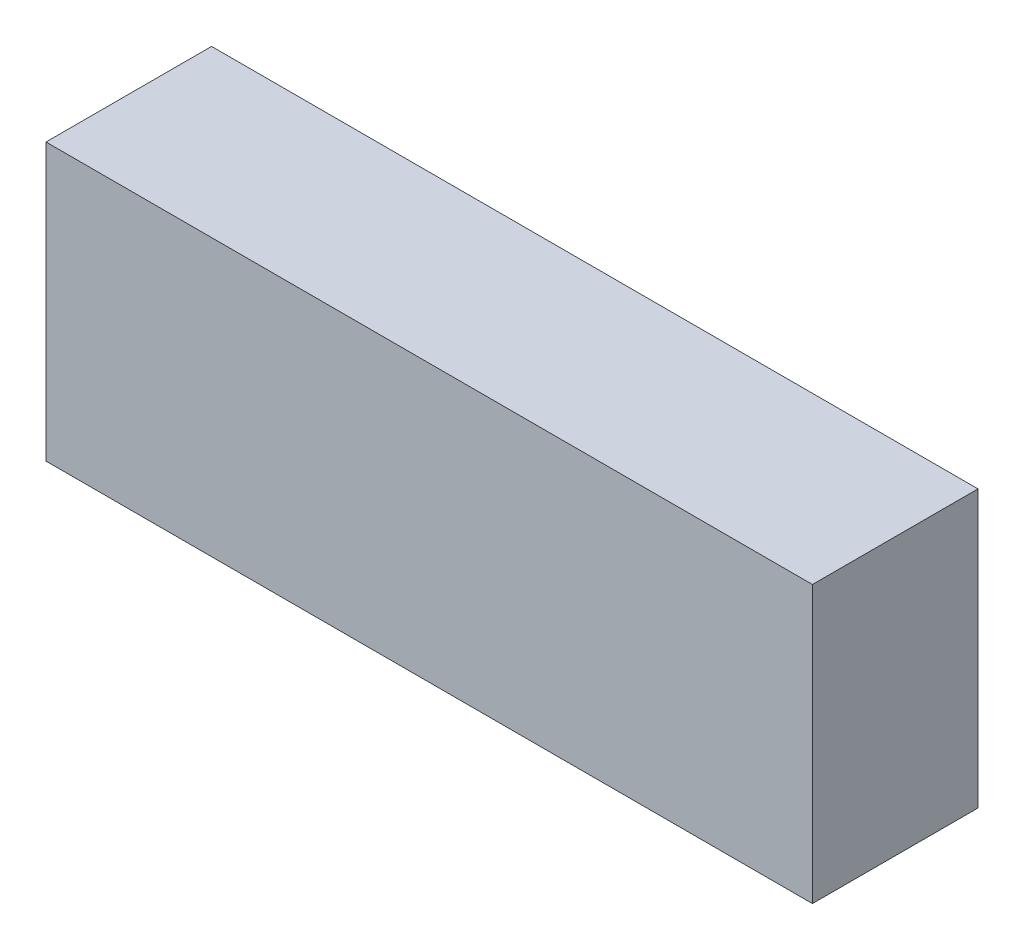
ISO-10303-21;
HEADER;
FILE_DESCRIPTION(('STEP AP214'),'2;1');
FILE_NAME('part.step','',(''),(''),'','','');
FILE_SCHEMA(('AUTOMOTIVE_DESIGN { 1 0 10303 214 1 1 1 1 }'));
ENDSEC;
DATA;
#1=APPLICATION_CONTEXT('core data for automotive mechanical design processes');
#2=APPLICATION_PROTOCOL_DEFINITION('international standard','automotive_design',2000,#1);
#3=PRODUCT_CONTEXT('',#1,'mechanical');
#4=PRODUCT('Part','Part','',(#3));
#5=PRODUCT_RELATED_PRODUCT_CATEGORY('part','',(#4));
#6=PRODUCT_DEFINITION_FORMATION('','',#4);
#7=PRODUCT_DEFINITION_CONTEXT('part definition',#1,'design');
#8=PRODUCT_DEFINITION('design','',#6,#7);
#9=PRODUCT_DEFINITION_SHAPE('','',#8);
#10=(LENGTH_UNIT() NAMED_UNIT(*) SI_UNIT(.MILLI.,.METRE.));
#11=(NAMED_UNIT(*) PLANE_ANGLE_UNIT() SI_UNIT($,.RADIAN.));
#12=(NAMED_UNIT(*) SI_UNIT($,.STERADIAN.) SOLID_ANGLE_UNIT());
#13=UNCERTAINTY_MEASURE_WITH_UNIT(LENGTH_MEASURE(1.E-05),#10,'distance_accuracy_value','');
#14=(GEOMETRIC_REPRESENTATION_CONTEXT(3) GLOBAL_UNCERTAINTY_ASSIGNED_CONTEXT((#13)) GLOBAL_UNIT_ASSIGNED_CONTEXT((#10,
#11,#12)) REPRESENTATION_CONTEXT('',''));
#15=CARTESIAN_POINT('',(0.,0.,0.));
#16=DIRECTION('',(0.,0.,1.));
#17=DIRECTION('',(1.,0.,0.));
#18=AXIS2_PLACEMENT_3D('',#15,#16,#17);
#19=CARTESIAN_POINT('',(-4.45549999999999,77.5714301256037,7.25));
#20=DIRECTION('',(1.,0.,0.));
#21=DIRECTION('',(0.,1.,0.));
#22=AXIS2_PLACEMENT_3D('',#19,#20,#21);
#23=PLANE('',#22);
#24=DIRECTION('',(0.,-1.,0.));
#25=VECTOR('',#24,1.);
#26=CARTESIAN_POINT('',(-4.45549999999999,77.5714301256037,0.));
#27=LINE('',#26,#25);
#28=CARTESIAN_POINT('',(-4.45549999999999,77.5714301256037,0.));
#29=VERTEX_POINT('',#28);
#30=CARTESIAN_POINT('',(-4.45549999999999,65.47,0.));
#31=VERTEX_POINT('',#30);
#32=EDGE_CURVE('E149',#29,#31,#27,.T.);
#33=ORIENTED_EDGE('',*,*,#32,.T.);
#34=DIRECTION('',(0.,0.,-1.));
#35=VECTOR('',#34,1.);
#36=CARTESIAN_POINT('',(-4.45549999999999,65.47,7.25));
#37=LINE('',#36,#35);
#38=CARTESIAN_POINT('',(-4.45549999999999,65.47,7.25));
#39=VERTEX_POINT('',#38);
#40=EDGE_CURVE('E11',#39,#31,#37,.T.);
#41=ORIENTED_EDGE('',*,*,#40,.F.);
#42=DIRECTION('',(0.,-1.,0.));
#43=VECTOR('',#42,1.);
#44=CARTESIAN_POINT('',(-4.45549999999999,77.5714301256037,7.25));
#45=LINE('',#44,#43);
#46=CARTESIAN_POINT('',(-4.45549999999999,77.5714301256037,7.25));
#47=VERTEX_POINT('',#46);
#48=EDGE_CURVE('E140',#47,#39,#45,.T.);
#49=ORIENTED_EDGE('',*,*,#48,.F.);
#50=DIRECTION('',(0.,0.,-1.));
#51=VECTOR('',#50,1.);
#52=CARTESIAN_POINT('',(-4.45549999999999,77.5714301256037,7.25));
#53=LINE('',#52,#51);
#54=EDGE_CURVE('E55',#47,#29,#53,.T.);
#55=ORIENTED_EDGE('',*,*,#54,.T.);
#56=EDGE_LOOP('',(#33,#41,#49,#55));
#57=FACE_BOUND('',#56,.T.);
#58=ADVANCED_FACE('F32',(#57),#23,.F.);
#59=CARTESIAN_POINT('',(-4.45549999999999,65.47,7.25));
#60=DIRECTION('',(0.,1.,0.));
#61=DIRECTION('',(0.,0.,1.));
#62=AXIS2_PLACEMENT_3D('',#59,#60,#61);
#63=PLANE('',#62);
#64=DIRECTION('',(1.,0.,0.));
#65=VECTOR('',#64,1.);
#66=CARTESIAN_POINT('',(-4.45549999999999,65.47,0.));
#67=LINE('',#66,#65);
#68=CARTESIAN_POINT('',(29.1045,65.47,0.));
#69=VERTEX_POINT('',#68);
#70=EDGE_CURVE('E151',#31,#69,#67,.T.);
#71=ORIENTED_EDGE('',*,*,#70,.T.);
#72=DIRECTION('',(0.,0.,-1.));
#73=VECTOR('',#72,1.);
#74=CARTESIAN_POINT('',(29.1045,65.47,7.25));
#75=LINE('',#74,#73);
#76=CARTESIAN_POINT('',(29.1045,65.47,7.25));
#77=VERTEX_POINT('',#76);
#78=EDGE_CURVE('E39',#77,#69,#75,.T.);
#79=ORIENTED_EDGE('',*,*,#78,.F.);
#80=DIRECTION('',(1.,0.,0.));
#81=VECTOR('',#80,1.);
#82=CARTESIAN_POINT('',(-4.45549999999999,65.47,7.25));
#83=LINE('',#82,#81);
#84=EDGE_CURVE('E81',#39,#77,#83,.T.);
#85=ORIENTED_EDGE('',*,*,#84,.F.);
#86=ORIENTED_EDGE('',*,*,#40,.T.);
#87=EDGE_LOOP('',(#71,#79,#85,#86));
#88=FACE_BOUND('',#87,.T.);
#89=ADVANCED_FACE('F166',(#88),#63,.F.);
#90=CARTESIAN_POINT('',(29.1045,77.5714301256037,7.25));
#91=DIRECTION('',(1.,0.,0.));
#92=DIRECTION('',(0.,0.,-1.));
#93=AXIS2_PLACEMENT_3D('',#90,#91,#92);
#94=PLANE('',#93);
#95=DIRECTION('',(0.,-1.,0.));
#96=VECTOR('',#95,1.);
#97=CARTESIAN_POINT('',(29.1045,77.5714301256037,0.));
#98=LINE('',#97,#96);
#99=CARTESIAN_POINT('',(29.1045,77.5714301256037,0.));
#100=VERTEX_POINT('',#99);
#101=EDGE_CURVE('E155',#100,#69,#98,.T.);
#102=ORIENTED_EDGE('',*,*,#101,.F.);
#103=DIRECTION('',(0.,0.,-1.));
#104=VECTOR('',#103,1.);
#105=CARTESIAN_POINT('',(29.1045,77.5714301256037,7.25));
#106=LINE('',#105,#104);
#107=CARTESIAN_POINT('',(29.1045,77.5714301256037,7.25));
#108=VERTEX_POINT('',#107);
#109=EDGE_CURVE('E161',#108,#100,#106,.T.);
#110=ORIENTED_EDGE('',*,*,#109,.F.);
#111=DIRECTION('',(0.,-1.,0.));
#112=VECTOR('',#111,1.);
#113=CARTESIAN_POINT('',(29.1045,77.5714301256037,7.25));
#114=LINE('',#113,#112);
#115=EDGE_CURVE('E144',#108,#77,#114,.T.);
#116=ORIENTED_EDGE('',*,*,#115,.T.);
#117=ORIENTED_EDGE('',*,*,#78,.T.);
#118=EDGE_LOOP('',(#102,#110,#116,#117));
#119=FACE_BOUND('',#118,.T.);
#120=ADVANCED_FACE('F164',(#119),#94,.T.);
#121=CARTESIAN_POINT('',(-4.45549999999999,77.5714301256037,7.25));
#122=DIRECTION('',(0.,1.,0.));
#123=DIRECTION('',(0.,0.,1.));
#124=AXIS2_PLACEMENT_3D('',#121,#122,#123);
#125=PLANE('',#124);
#126=DIRECTION('',(1.,0.,0.));
#127=VECTOR('',#126,1.);
#128=CARTESIAN_POINT('',(-4.45549999999999,77.5714301256037,0.));
#129=LINE('',#128,#127);
#130=EDGE_CURVE('E142',#29,#100,#129,.T.);
#131=ORIENTED_EDGE('',*,*,#130,.F.);
#132=ORIENTED_EDGE('',*,*,#54,.F.);
#133=DIRECTION('',(1.,0.,0.));
#134=VECTOR('',#133,1.);
#135=CARTESIAN_POINT('',(-4.45549999999999,77.5714301256037,7.25));
#136=LINE('',#135,#134);
#137=EDGE_CURVE('E147',#47,#108,#136,.T.);
#138=ORIENTED_EDGE('',*,*,#137,.T.);
#139=ORIENTED_EDGE('',*,*,#109,.T.);
#140=EDGE_LOOP('',(#131,#132,#138,#139));
#141=FACE_BOUND('',#140,.T.);
#142=ADVANCED_FACE('F170',(#141),#125,.T.);
#143=CARTESIAN_POINT('',(0.,0.,7.25));
#144=DIRECTION('',(0.,0.,1.));
#145=DIRECTION('',(1.,0.,0.));
#146=AXIS2_PLACEMENT_3D('',#143,#144,#145);
#147=PLANE('',#146);
#148=ORIENTED_EDGE('',*,*,#48,.T.);
#149=ORIENTED_EDGE('',*,*,#84,.T.);
#150=ORIENTED_EDGE('',*,*,#115,.F.);
#151=ORIENTED_EDGE('',*,*,#137,.F.);
#152=EDGE_LOOP('',(#148,#149,#150,#151));
#153=FACE_BOUND('',#152,.T.);
#154=ADVANCED_FACE('F173',(#153),#147,.T.);
#155=CARTESIAN_POINT('',(0.,0.,0.));
#156=DIRECTION('',(0.,0.,1.));
#157=DIRECTION('',(1.,0.,0.));
#158=AXIS2_PLACEMENT_3D('',#155,#156,#157);
#159=PLANE('',#158);
#160=DIRECTION('',(1.,0.,0.));
#161=VECTOR('',#160,1.);
#162=CARTESIAN_POINT('',(-4.45549999999999,77.0714301256037,0.));
#163=LINE('',#162,#161);
#164=CARTESIAN_POINT('',(-3.95549999999999,77.0714301256037,0.));
#165=VERTEX_POINT('',#164);
#166=CARTESIAN_POINT('',(28.6045,77.0714301256037,0.));
#167=VERTEX_POINT('',#166);
#168=EDGE_CURVE('E125',#165,#167,#163,.T.);
#169=ORIENTED_EDGE('',*,*,#168,.F.);
#170=DIRECTION('',(0.,-1.,0.));
#171=VECTOR('',#170,1.);
#172=CARTESIAN_POINT('',(-3.95549999999999,77.5714301256037,0.));
#173=LINE('',#172,#171);
#174=CARTESIAN_POINT('',(-3.95549999999999,65.97,0.));
#175=VERTEX_POINT('',#174);
#176=EDGE_CURVE('E112',#165,#175,#173,.T.);
#177=ORIENTED_EDGE('',*,*,#176,.T.);
#178=DIRECTION('',(1.,0.,0.));
#179=VECTOR('',#178,1.);
#180=CARTESIAN_POINT('',(-4.45549999999999,65.97,0.));
#181=LINE('',#180,#179);
#182=CARTESIAN_POINT('',(28.6045,65.97,0.));
#183=VERTEX_POINT('',#182);
#184=EDGE_CURVE('E135',#175,#183,#181,.T.);
#185=ORIENTED_EDGE('',*,*,#184,.T.);
#186=DIRECTION('',(0.,-1.,0.));
#187=VECTOR('',#186,1.);
#188=CARTESIAN_POINT('',(28.6045,77.5714301256037,0.));
#189=LINE('',#188,#187);
#190=EDGE_CURVE('E46',#167,#183,#189,.T.);
#191=ORIENTED_EDGE('',*,*,#190,.F.);
#192=EDGE_LOOP('',(#169,#177,#185,#191));
#193=FACE_BOUND('',#192,.T.);
#194=ORIENTED_EDGE('',*,*,#32,.F.);
#195=ORIENTED_EDGE('',*,*,#130,.T.);
#196=ORIENTED_EDGE('',*,*,#101,.T.);
#197=ORIENTED_EDGE('',*,*,#70,.F.);
#198=EDGE_LOOP('',(#194,#195,#196,#197));
#199=FACE_BOUND('',#198,.T.);
#200=ADVANCED_FACE('F169',(#193,#199),#159,.F.);
#201=CARTESIAN_POINT('',(-3.95549999999999,77.5714301256037,7.25));
#202=DIRECTION('',(1.,0.,0.));
#203=DIRECTION('',(0.,1.,0.));
#204=AXIS2_PLACEMENT_3D('',#201,#202,#203);
#205=PLANE('',#204);
#206=ORIENTED_EDGE('',*,*,#176,.F.);
#207=DIRECTION('',(0.,0.,-1.));
#208=VECTOR('',#207,1.);
#209=CARTESIAN_POINT('',(-3.95549999999999,77.0714301256037,7.25));
#210=LINE('',#209,#208);
#211=CARTESIAN_POINT('',(-3.95549999999999,77.0714301256037,7.05));
#212=VERTEX_POINT('',#211);
#213=EDGE_CURVE('E105',#212,#165,#210,.T.);
#214=ORIENTED_EDGE('',*,*,#213,.F.);
#215=DIRECTION('',(0.,-1.,0.));
#216=VECTOR('',#215,1.);
#217=CARTESIAN_POINT('',(-3.95549999999999,77.5714301256037,7.05));
#218=LINE('',#217,#216);
#219=CARTESIAN_POINT('',(-3.95549999999999,65.97,7.05));
#220=VERTEX_POINT('',#219);
#221=EDGE_CURVE('E109',#212,#220,#218,.T.);
#222=ORIENTED_EDGE('',*,*,#221,.T.);
#223=DIRECTION('',(0.,0.,-1.));
#224=VECTOR('',#223,1.);
#225=CARTESIAN_POINT('',(-3.95549999999999,65.97,7.25));
#226=LINE('',#225,#224);
#227=EDGE_CURVE('E152',#220,#175,#226,.T.);
#228=ORIENTED_EDGE('',*,*,#227,.T.);
#229=EDGE_LOOP('',(#206,#214,#222,#228));
#230=FACE_BOUND('',#229,.T.);
#231=ADVANCED_FACE('F107',(#230),#205,.T.);
#232=CARTESIAN_POINT('',(-4.45549999999999,65.97,7.25));
#233=DIRECTION('',(0.,1.,0.));
#234=DIRECTION('',(0.,0.,1.));
#235=AXIS2_PLACEMENT_3D('',#232,#233,#234);
#236=PLANE('',#235);
#237=ORIENTED_EDGE('',*,*,#184,.F.);
#238=ORIENTED_EDGE('',*,*,#227,.F.);
#239=DIRECTION('',(1.,0.,0.));
#240=VECTOR('',#239,1.);
#241=CARTESIAN_POINT('',(-4.45549999999999,65.97,7.05));
#242=LINE('',#241,#240);
#243=CARTESIAN_POINT('',(28.6045,65.97,7.05));
#244=VERTEX_POINT('',#243);
#245=EDGE_CURVE('E124',#220,#244,#242,.T.);
#246=ORIENTED_EDGE('',*,*,#245,.T.);
#247=DIRECTION('',(0.,0.,-1.));
#248=VECTOR('',#247,1.);
#249=CARTESIAN_POINT('',(28.6045,65.97,7.25));
#250=LINE('',#249,#248);
#251=EDGE_CURVE('E264',#244,#183,#250,.T.);
#252=ORIENTED_EDGE('',*,*,#251,.T.);
#253=EDGE_LOOP('',(#237,#238,#246,#252));
#254=FACE_BOUND('',#253,.T.);
#255=ADVANCED_FACE('F197',(#254),#236,.T.);
#256=CARTESIAN_POINT('',(28.6045,77.5714301256037,7.25));
#257=DIRECTION('',(1.,0.,0.));
#258=DIRECTION('',(0.,0.,-1.));
#259=AXIS2_PLACEMENT_3D('',#256,#257,#258);
#260=PLANE('',#259);
#261=ORIENTED_EDGE('',*,*,#190,.T.);
#262=ORIENTED_EDGE('',*,*,#251,.F.);
#263=DIRECTION('',(0.,-1.,0.));
#264=VECTOR('',#263,1.);
#265=CARTESIAN_POINT('',(28.6045,77.5714301256037,7.05));
#266=LINE('',#265,#264);
#267=CARTESIAN_POINT('',(28.6045,77.0714301256037,7.05));
#268=VERTEX_POINT('',#267);
#269=EDGE_CURVE('E129',#268,#244,#266,.T.);
#270=ORIENTED_EDGE('',*,*,#269,.F.);
#271=DIRECTION('',(0.,0.,-1.));
#272=VECTOR('',#271,1.);
#273=CARTESIAN_POINT('',(28.6045,77.0714301256037,7.25));
#274=LINE('',#273,#272);
#275=EDGE_CURVE('E117',#268,#167,#274,.T.);
#276=ORIENTED_EDGE('',*,*,#275,.T.);
#277=EDGE_LOOP('',(#261,#262,#270,#276));
#278=FACE_BOUND('',#277,.T.);
#279=ADVANCED_FACE('F194',(#278),#260,.F.);
#280=CARTESIAN_POINT('',(-4.45549999999999,77.0714301256037,7.25));
#281=DIRECTION('',(0.,1.,0.));
#282=DIRECTION('',(0.,0.,1.));
#283=AXIS2_PLACEMENT_3D('',#280,#281,#282);
#284=PLANE('',#283);
#285=ORIENTED_EDGE('',*,*,#168,.T.);
#286=ORIENTED_EDGE('',*,*,#275,.F.);
#287=DIRECTION('',(1.,0.,0.));
#288=VECTOR('',#287,1.);
#289=CARTESIAN_POINT('',(-4.45549999999999,77.0714301256037,7.05));
#290=LINE('',#289,#288);
#291=EDGE_CURVE('E118',#212,#268,#290,.T.);
#292=ORIENTED_EDGE('',*,*,#291,.F.);
#293=ORIENTED_EDGE('',*,*,#213,.T.);
#294=EDGE_LOOP('',(#285,#286,#292,#293));
#295=FACE_BOUND('',#294,.T.);
#296=ADVANCED_FACE('F127',(#295),#284,.F.);
#297=CARTESIAN_POINT('',(0.,0.,7.05));
#298=DIRECTION('',(0.,0.,1.));
#299=DIRECTION('',(1.,0.,0.));
#300=AXIS2_PLACEMENT_3D('',#297,#298,#299);
#301=PLANE('',#300);
#302=ORIENTED_EDGE('',*,*,#221,.F.);
#303=ORIENTED_EDGE('',*,*,#291,.T.);
#304=ORIENTED_EDGE('',*,*,#269,.T.);
#305=ORIENTED_EDGE('',*,*,#245,.F.);
#306=EDGE_LOOP('',(#302,#303,#304,#305));
#307=FACE_BOUND('',#306,.T.);
#308=ADVANCED_FACE('F122',(#307),#301,.F.);
#309=CLOSED_SHELL('',(#58,#89,#120,#142,#154,#200,#231,#255,#279,#296,#308));
#310=MANIFOLD_SOLID_BREP('B2',#309);
#311=ADVANCED_BREP_SHAPE_REPRESENTATION('',(#18,#310),#14);
#312=SHAPE_DEFINITION_REPRESENTATION(#9,#311);
ENDSEC;
END-ISO-10303-21;
